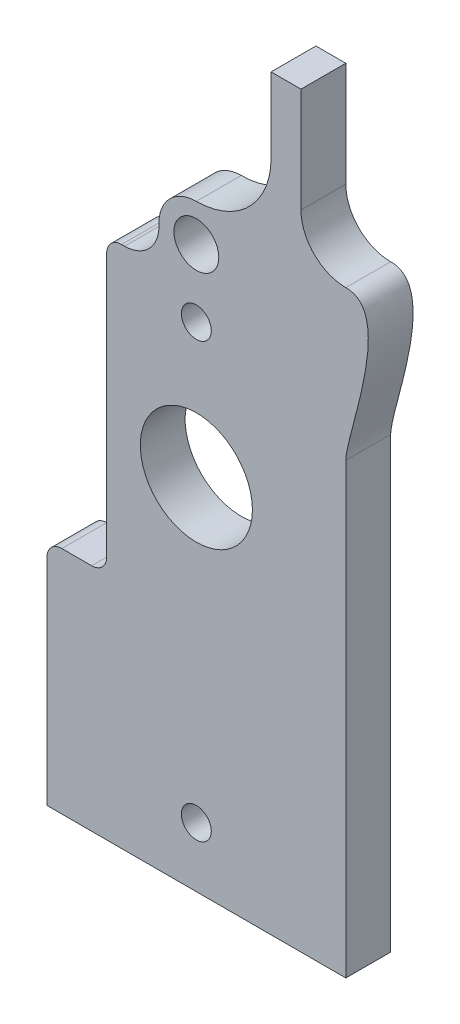
ISO-10303-21;
HEADER;
FILE_DESCRIPTION(('STEP AP214'),'2;1');
FILE_NAME('part.step','',(''),(''),'','','');
FILE_SCHEMA(('AUTOMOTIVE_DESIGN { 1 0 10303 214 1 1 1 1 }'));
ENDSEC;
DATA;
#1=APPLICATION_CONTEXT('core data for automotive mechanical design processes');
#2=APPLICATION_PROTOCOL_DEFINITION('international standard','automotive_design',2000,#1);
#3=PRODUCT_CONTEXT('',#1,'mechanical');
#4=PRODUCT('Part','Part','',(#3));
#5=PRODUCT_RELATED_PRODUCT_CATEGORY('part','',(#4));
#6=PRODUCT_DEFINITION_FORMATION('','',#4);
#7=PRODUCT_DEFINITION_CONTEXT('part definition',#1,'design');
#8=PRODUCT_DEFINITION('design','',#6,#7);
#9=PRODUCT_DEFINITION_SHAPE('','',#8);
#10=(LENGTH_UNIT() NAMED_UNIT(*) SI_UNIT(.MILLI.,.METRE.));
#11=(NAMED_UNIT(*) PLANE_ANGLE_UNIT() SI_UNIT($,.RADIAN.));
#12=(NAMED_UNIT(*) SI_UNIT($,.STERADIAN.) SOLID_ANGLE_UNIT());
#13=UNCERTAINTY_MEASURE_WITH_UNIT(LENGTH_MEASURE(1.E-05),#10,'distance_accuracy_value','');
#14=(GEOMETRIC_REPRESENTATION_CONTEXT(3) GLOBAL_UNCERTAINTY_ASSIGNED_CONTEXT((#13)) GLOBAL_UNIT_ASSIGNED_CONTEXT((#10,
#11,#12)) REPRESENTATION_CONTEXT('',''));
#15=CARTESIAN_POINT('',(0.,0.,0.));
#16=DIRECTION('',(0.,0.,1.));
#17=DIRECTION('',(1.,0.,0.));
#18=AXIS2_PLACEMENT_3D('',#15,#16,#17);
#19=CARTESIAN_POINT('',(11.2684211738149,35.6016585340508,3.));
#20=DIRECTION('',(0.,0.,1.));
#21=DIRECTION('',(1.,0.,0.));
#22=AXIS2_PLACEMENT_3D('',#19,#20,#21);
#23=PLANE('',#22);
#24=CARTESIAN_POINT('',(0.,4.,3.));
#25=DIRECTION('',(0.,0.,1.));
#26=DIRECTION('',(1.,0.,0.));
#27=AXIS2_PLACEMENT_3D('',#24,#25,#26);
#28=CIRCLE('',#27,1.);
#29=CARTESIAN_POINT('',(1.,4.,3.));
#30=VERTEX_POINT('',#29);
#31=EDGE_CURVE('E374',#30,#30,#28,.T.);
#32=ORIENTED_EDGE('',*,*,#31,.F.);
#33=EDGE_LOOP('',(#32));
#34=FACE_BOUND('',#33,.T.);
#35=CARTESIAN_POINT('',(0.,37.5,3.));
#36=DIRECTION('',(0.,0.,1.));
#37=DIRECTION('',(1.,0.,0.));
#38=AXIS2_PLACEMENT_3D('',#35,#36,#37);
#39=CIRCLE('',#38,1.5);
#40=CARTESIAN_POINT('',(1.5,37.5,3.));
#41=VERTEX_POINT('',#40);
#42=EDGE_CURVE('E193',#41,#41,#39,.T.);
#43=ORIENTED_EDGE('',*,*,#42,.F.);
#44=EDGE_LOOP('',(#43));
#45=FACE_BOUND('',#44,.T.);
#46=DIRECTION('',(1.,0.,0.));
#47=VECTOR('',#46,1.);
#48=CARTESIAN_POINT('',(-10.,0.,3.));
#49=LINE('',#48,#47);
#50=CARTESIAN_POINT('',(-10.,0.,3.));
#51=VERTEX_POINT('',#50);
#52=CARTESIAN_POINT('',(10.,0.,3.));
#53=VERTEX_POINT('',#52);
#54=EDGE_CURVE('E230',#51,#53,#49,.T.);
#55=ORIENTED_EDGE('',*,*,#54,.T.);
#56=DIRECTION('',(0.,1.,0.));
#57=VECTOR('',#56,1.);
#58=CARTESIAN_POINT('',(10.,0.,3.));
#59=LINE('',#58,#57);
#60=CARTESIAN_POINT('',(10.,30.,3.));
#61=VERTEX_POINT('',#60);
#62=EDGE_CURVE('E122',#53,#61,#59,.T.);
#63=ORIENTED_EDGE('',*,*,#62,.T.);
#64=CARTESIAN_POINT('',(9.99999999999999,30.,3.));
#65=CARTESIAN_POINT('',(10.,31.6044227574687,3.));
#66=CARTESIAN_POINT('',(13.3824564635064,40.,3.));
#67=CARTESIAN_POINT('',(9.99999999999999,40.,3.));
#68=B_SPLINE_CURVE_WITH_KNOTS('',3,(#64,#65,#66,#67),.UNSPECIFIED.,.F.,.F.,(4,4),(0.,1.),.UNSPECIFIED.);
#69=CARTESIAN_POINT('',(9.99999999999999,40.,3.));
#70=VERTEX_POINT('',#69);
#71=EDGE_CURVE('E275',#61,#70,#68,.T.);
#72=ORIENTED_EDGE('',*,*,#71,.T.);
#73=CARTESIAN_POINT('',(10.,43.,3.));
#74=DIRECTION('',(0.,0.,-1.));
#75=DIRECTION('',(1.,0.,0.));
#76=AXIS2_PLACEMENT_3D('',#73,#74,#75);
#77=CIRCLE('',#76,3.);
#78=CARTESIAN_POINT('',(7.,43.,3.));
#79=VERTEX_POINT('',#78);
#80=EDGE_CURVE('E294',#70,#79,#77,.T.);
#81=ORIENTED_EDGE('',*,*,#80,.T.);
#82=DIRECTION('',(0.,1.,0.));
#83=VECTOR('',#82,1.);
#84=CARTESIAN_POINT('',(7.,50.,3.));
#85=LINE('',#84,#83);
#86=CARTESIAN_POINT('',(7.,50.,3.));
#87=VERTEX_POINT('',#86);
#88=EDGE_CURVE('E291',#79,#87,#85,.T.);
#89=ORIENTED_EDGE('',*,*,#88,.T.);
#90=DIRECTION('',(-1.,0.,0.));
#91=VECTOR('',#90,1.);
#92=CARTESIAN_POINT('',(5.,50.,3.));
#93=LINE('',#92,#91);
#94=CARTESIAN_POINT('',(5.,50.,3.));
#95=VERTEX_POINT('',#94);
#96=EDGE_CURVE('E293',#87,#95,#93,.T.);
#97=ORIENTED_EDGE('',*,*,#96,.T.);
#98=DIRECTION('',(0.,-1.,0.));
#99=VECTOR('',#98,1.);
#100=CARTESIAN_POINT('',(5.,45.,3.));
#101=LINE('',#100,#99);
#102=CARTESIAN_POINT('',(5.,45.,3.));
#103=VERTEX_POINT('',#102);
#104=EDGE_CURVE('E296',#95,#103,#101,.T.);
#105=ORIENTED_EDGE('',*,*,#104,.T.);
#106=CARTESIAN_POINT('',(0.,45.,3.));
#107=DIRECTION('',(0.,0.,-1.));
#108=DIRECTION('',(1.,0.,0.));
#109=AXIS2_PLACEMENT_3D('',#106,#107,#108);
#110=CIRCLE('',#109,5.);
#111=CARTESIAN_POINT('',(0.,40.,3.));
#112=VERTEX_POINT('',#111);
#113=EDGE_CURVE('E302',#103,#112,#110,.T.);
#114=ORIENTED_EDGE('',*,*,#113,.T.);
#115=CARTESIAN_POINT('',(0.,37.5,3.));
#116=DIRECTION('',(0.,0.,1.));
#117=DIRECTION('',(1.,0.,0.));
#118=AXIS2_PLACEMENT_3D('',#115,#116,#117);
#119=CIRCLE('',#118,2.5);
#120=CARTESIAN_POINT('',(-2.49999999999999,37.5,3.));
#121=VERTEX_POINT('',#120);
#122=EDGE_CURVE('E304',#112,#121,#119,.T.);
#123=ORIENTED_EDGE('',*,*,#122,.T.);
#124=DIRECTION('',(0.,-1.,0.));
#125=VECTOR('',#124,1.);
#126=CARTESIAN_POINT('',(-2.49999999999999,37.3,3.));
#127=LINE('',#126,#125);
#128=CARTESIAN_POINT('',(-2.49999999999999,37.3,3.));
#129=VERTEX_POINT('',#128);
#130=EDGE_CURVE('E306',#121,#129,#127,.T.);
#131=ORIENTED_EDGE('',*,*,#130,.T.);
#132=CARTESIAN_POINT('',(-4.8,37.3,3.));
#133=DIRECTION('',(0.,0.,-1.));
#134=DIRECTION('',(1.,0.,0.));
#135=AXIS2_PLACEMENT_3D('',#132,#133,#134);
#136=CIRCLE('',#135,2.3);
#137=CARTESIAN_POINT('',(-4.80000000000001,35.,3.));
#138=VERTEX_POINT('',#137);
#139=EDGE_CURVE('E308',#129,#138,#136,.T.);
#140=ORIENTED_EDGE('',*,*,#139,.T.);
#141=DIRECTION('',(-1.,0.,0.));
#142=VECTOR('',#141,1.);
#143=CARTESIAN_POINT('',(-4.99999999999999,35.,3.));
#144=LINE('',#143,#142);
#145=CARTESIAN_POINT('',(-4.99999999999999,35.,3.));
#146=VERTEX_POINT('',#145);
#147=EDGE_CURVE('E310',#138,#146,#144,.T.);
#148=ORIENTED_EDGE('',*,*,#147,.T.);
#149=CARTESIAN_POINT('',(-5.,34.,3.));
#150=DIRECTION('',(0.,0.,1.));
#151=DIRECTION('',(-1.,0.,0.));
#152=AXIS2_PLACEMENT_3D('',#149,#150,#151);
#153=CIRCLE('',#152,1.);
#154=CARTESIAN_POINT('',(-6.,34.,3.));
#155=VERTEX_POINT('',#154);
#156=EDGE_CURVE('E312',#146,#155,#153,.T.);
#157=ORIENTED_EDGE('',*,*,#156,.T.);
#158=DIRECTION('',(0.,-1.,0.));
#159=VECTOR('',#158,1.);
#160=CARTESIAN_POINT('',(-6.,34.,3.));
#161=LINE('',#160,#159);
#162=CARTESIAN_POINT('',(-6.,16.383156030193,3.));
#163=VERTEX_POINT('',#162);
#164=EDGE_CURVE('E314',#155,#163,#161,.T.);
#165=ORIENTED_EDGE('',*,*,#164,.T.);
#166=CARTESIAN_POINT('',(-7.,16.3831560301929,3.));
#167=DIRECTION('',(0.,0.,-1.));
#168=DIRECTION('',(1.,0.,0.));
#169=AXIS2_PLACEMENT_3D('',#166,#167,#168);
#170=CIRCLE('',#169,1.);
#171=CARTESIAN_POINT('',(-7.00000000000001,15.3831560301929,3.));
#172=VERTEX_POINT('',#171);
#173=EDGE_CURVE('E171',#163,#172,#170,.T.);
#174=ORIENTED_EDGE('',*,*,#173,.T.);
#175=DIRECTION('',(-1.,0.,0.));
#176=VECTOR('',#175,1.);
#177=CARTESIAN_POINT('',(-7.00000000000001,15.3831560301929,3.));
#178=LINE('',#177,#176);
#179=CARTESIAN_POINT('',(-9.,15.3831560301929,3.));
#180=VERTEX_POINT('',#179);
#181=EDGE_CURVE('E165',#172,#180,#178,.T.);
#182=ORIENTED_EDGE('',*,*,#181,.T.);
#183=CARTESIAN_POINT('',(-9.00000000000001,14.3831560301929,3.));
#184=DIRECTION('',(0.,0.,1.));
#185=DIRECTION('',(1.,0.,0.));
#186=AXIS2_PLACEMENT_3D('',#183,#184,#185);
#187=CIRCLE('',#186,1.);
#188=CARTESIAN_POINT('',(-10.,14.3831560301929,3.));
#189=VERTEX_POINT('',#188);
#190=EDGE_CURVE('E169',#180,#189,#187,.T.);
#191=ORIENTED_EDGE('',*,*,#190,.T.);
#192=DIRECTION('',(0.,-1.,0.));
#193=VECTOR('',#192,1.);
#194=CARTESIAN_POINT('',(-10.,14.3831560301929,3.));
#195=LINE('',#194,#193);
#196=EDGE_CURVE('E49',#189,#51,#195,.T.);
#197=ORIENTED_EDGE('',*,*,#196,.T.);
#198=EDGE_LOOP('',(#55,#63,#72,#81,#89,#97,#105,#114,#123,#131,#140,#148,#157,#165,#174,#182,
#191,#197));
#199=FACE_BOUND('',#198,.T.);
#200=CARTESIAN_POINT('',(0.,33.,3.));
#201=DIRECTION('',(0.,0.,1.));
#202=DIRECTION('',(1.,0.,0.));
#203=AXIS2_PLACEMENT_3D('',#200,#201,#202);
#204=CIRCLE('',#203,1.);
#205=CARTESIAN_POINT('',(1.,33.,3.));
#206=VERTEX_POINT('',#205);
#207=EDGE_CURVE('E380',#206,#206,#204,.T.);
#208=ORIENTED_EDGE('',*,*,#207,.F.);
#209=EDGE_LOOP('',(#208));
#210=FACE_BOUND('',#209,.T.);
#211=CARTESIAN_POINT('',(0.,24.,3.));
#212=DIRECTION('',(0.,0.,1.));
#213=DIRECTION('',(1.,0.,0.));
#214=AXIS2_PLACEMENT_3D('',#211,#212,#213);
#215=CIRCLE('',#214,3.75);
#216=CARTESIAN_POINT('',(3.75,24.,3.));
#217=VERTEX_POINT('',#216);
#218=EDGE_CURVE('E365',#217,#217,#215,.T.);
#219=ORIENTED_EDGE('',*,*,#218,.F.);
#220=EDGE_LOOP('',(#219));
#221=FACE_BOUND('',#220,.T.);
#222=ADVANCED_FACE('F32',(#34,#45,#199,#210,#221),#23,.T.);
#223=CARTESIAN_POINT('',(11.2684211738149,35.6016585340508,0.));
#224=DIRECTION('',(0.,0.,1.));
#225=DIRECTION('',(1.,0.,0.));
#226=AXIS2_PLACEMENT_3D('',#223,#224,#225);
#227=PLANE('',#226);
#228=CARTESIAN_POINT('',(0.,4.,0.));
#229=DIRECTION('',(0.,0.,1.));
#230=DIRECTION('',(1.,0.,0.));
#231=AXIS2_PLACEMENT_3D('',#228,#229,#230);
#232=CIRCLE('',#231,1.);
#233=CARTESIAN_POINT('',(1.,4.,0.));
#234=VERTEX_POINT('',#233);
#235=EDGE_CURVE('E371',#234,#234,#232,.T.);
#236=ORIENTED_EDGE('',*,*,#235,.T.);
#237=EDGE_LOOP('',(#236));
#238=FACE_BOUND('',#237,.T.);
#239=CARTESIAN_POINT('',(0.,37.5,0.));
#240=DIRECTION('',(0.,0.,1.));
#241=DIRECTION('',(1.,0.,0.));
#242=AXIS2_PLACEMENT_3D('',#239,#240,#241);
#243=CIRCLE('',#242,1.5);
#244=CARTESIAN_POINT('',(1.5,37.5,0.));
#245=VERTEX_POINT('',#244);
#246=EDGE_CURVE('E383',#245,#245,#243,.T.);
#247=ORIENTED_EDGE('',*,*,#246,.T.);
#248=EDGE_LOOP('',(#247));
#249=FACE_BOUND('',#248,.T.);
#250=DIRECTION('',(1.,0.,0.));
#251=VECTOR('',#250,1.);
#252=CARTESIAN_POINT('',(-10.,0.,0.));
#253=LINE('',#252,#251);
#254=CARTESIAN_POINT('',(-10.,0.,0.));
#255=VERTEX_POINT('',#254);
#256=CARTESIAN_POINT('',(10.,0.,0.));
#257=VERTEX_POINT('',#256);
#258=EDGE_CURVE('E189',#255,#257,#253,.T.);
#259=ORIENTED_EDGE('',*,*,#258,.F.);
#260=DIRECTION('',(0.,-1.,0.));
#261=VECTOR('',#260,1.);
#262=CARTESIAN_POINT('',(-10.,14.3831560301929,0.));
#263=LINE('',#262,#261);
#264=CARTESIAN_POINT('',(-10.,14.3831560301929,0.));
#265=VERTEX_POINT('',#264);
#266=EDGE_CURVE('E114',#265,#255,#263,.T.);
#267=ORIENTED_EDGE('',*,*,#266,.F.);
#268=CARTESIAN_POINT('',(-9.00000000000001,14.3831560301929,0.));
#269=DIRECTION('',(0.,0.,1.));
#270=DIRECTION('',(1.,0.,0.));
#271=AXIS2_PLACEMENT_3D('',#268,#269,#270);
#272=CIRCLE('',#271,1.);
#273=CARTESIAN_POINT('',(-9.,15.3831560301929,0.));
#274=VERTEX_POINT('',#273);
#275=EDGE_CURVE('E108',#274,#265,#272,.T.);
#276=ORIENTED_EDGE('',*,*,#275,.F.);
#277=DIRECTION('',(-1.,0.,0.));
#278=VECTOR('',#277,1.);
#279=CARTESIAN_POINT('',(-7.00000000000001,15.3831560301929,0.));
#280=LINE('',#279,#278);
#281=CARTESIAN_POINT('',(-7.00000000000001,15.3831560301929,0.));
#282=VERTEX_POINT('',#281);
#283=EDGE_CURVE('E179',#282,#274,#280,.T.);
#284=ORIENTED_EDGE('',*,*,#283,.F.);
#285=CARTESIAN_POINT('',(-7.,16.3831560301929,0.));
#286=DIRECTION('',(0.,0.,-1.));
#287=DIRECTION('',(1.,0.,0.));
#288=AXIS2_PLACEMENT_3D('',#285,#286,#287);
#289=CIRCLE('',#288,1.);
#290=CARTESIAN_POINT('',(-6.,16.383156030193,0.));
#291=VERTEX_POINT('',#290);
#292=EDGE_CURVE('E225',#291,#282,#289,.T.);
#293=ORIENTED_EDGE('',*,*,#292,.F.);
#294=DIRECTION('',(0.,-1.,0.));
#295=VECTOR('',#294,1.);
#296=CARTESIAN_POINT('',(-6.,16.383156030193,0.));
#297=LINE('',#296,#295);
#298=CARTESIAN_POINT('',(-6.,34.,0.));
#299=VERTEX_POINT('',#298);
#300=EDGE_CURVE('E223',#299,#291,#297,.T.);
#301=ORIENTED_EDGE('',*,*,#300,.F.);
#302=CARTESIAN_POINT('',(-5.,34.,0.));
#303=DIRECTION('',(0.,0.,1.));
#304=DIRECTION('',(-1.,0.,0.));
#305=AXIS2_PLACEMENT_3D('',#302,#303,#304);
#306=CIRCLE('',#305,1.);
#307=CARTESIAN_POINT('',(-4.99999999999999,35.,0.));
#308=VERTEX_POINT('',#307);
#309=EDGE_CURVE('E220',#308,#299,#306,.T.);
#310=ORIENTED_EDGE('',*,*,#309,.F.);
#311=DIRECTION('',(-1.,0.,0.));
#312=VECTOR('',#311,1.);
#313=CARTESIAN_POINT('',(-4.99999999999999,35.,0.));
#314=LINE('',#313,#312);
#315=CARTESIAN_POINT('',(-4.80000000000001,35.,0.));
#316=VERTEX_POINT('',#315);
#317=EDGE_CURVE('E218',#316,#308,#314,.T.);
#318=ORIENTED_EDGE('',*,*,#317,.F.);
#319=CARTESIAN_POINT('',(-4.8,37.3,0.));
#320=DIRECTION('',(0.,0.,-1.));
#321=DIRECTION('',(1.,0.,0.));
#322=AXIS2_PLACEMENT_3D('',#319,#320,#321);
#323=CIRCLE('',#322,2.3);
#324=CARTESIAN_POINT('',(-2.49999999999999,37.3,0.));
#325=VERTEX_POINT('',#324);
#326=EDGE_CURVE('E216',#325,#316,#323,.T.);
#327=ORIENTED_EDGE('',*,*,#326,.F.);
#328=DIRECTION('',(0.,-1.,0.));
#329=VECTOR('',#328,1.);
#330=CARTESIAN_POINT('',(-2.49999999999999,37.3,0.));
#331=LINE('',#330,#329);
#332=CARTESIAN_POINT('',(-2.49999999999999,37.5,0.));
#333=VERTEX_POINT('',#332);
#334=EDGE_CURVE('E214',#333,#325,#331,.T.);
#335=ORIENTED_EDGE('',*,*,#334,.F.);
#336=CARTESIAN_POINT('',(0.,37.5,0.));
#337=DIRECTION('',(0.,0.,1.));
#338=DIRECTION('',(1.,0.,0.));
#339=AXIS2_PLACEMENT_3D('',#336,#337,#338);
#340=CIRCLE('',#339,2.5);
#341=CARTESIAN_POINT('',(0.,40.,0.));
#342=VERTEX_POINT('',#341);
#343=EDGE_CURVE('E212',#342,#333,#340,.T.);
#344=ORIENTED_EDGE('',*,*,#343,.F.);
#345=CARTESIAN_POINT('',(0.,45.,0.));
#346=DIRECTION('',(0.,0.,-1.));
#347=DIRECTION('',(1.,0.,0.));
#348=AXIS2_PLACEMENT_3D('',#345,#346,#347);
#349=CIRCLE('',#348,5.);
#350=CARTESIAN_POINT('',(5.,45.,0.));
#351=VERTEX_POINT('',#350);
#352=EDGE_CURVE('E210',#351,#342,#349,.T.);
#353=ORIENTED_EDGE('',*,*,#352,.F.);
#354=DIRECTION('',(0.,-1.,0.));
#355=VECTOR('',#354,1.);
#356=CARTESIAN_POINT('',(5.,45.,0.));
#357=LINE('',#356,#355);
#358=CARTESIAN_POINT('',(5.,50.,0.));
#359=VERTEX_POINT('',#358);
#360=EDGE_CURVE('E208',#359,#351,#357,.T.);
#361=ORIENTED_EDGE('',*,*,#360,.F.);
#362=DIRECTION('',(-1.,0.,0.));
#363=VECTOR('',#362,1.);
#364=CARTESIAN_POINT('',(5.,50.,0.));
#365=LINE('',#364,#363);
#366=CARTESIAN_POINT('',(7.,50.,0.));
#367=VERTEX_POINT('',#366);
#368=EDGE_CURVE('E206',#367,#359,#365,.T.);
#369=ORIENTED_EDGE('',*,*,#368,.F.);
#370=DIRECTION('',(0.,1.,0.));
#371=VECTOR('',#370,1.);
#372=CARTESIAN_POINT('',(7.,50.,0.));
#373=LINE('',#372,#371);
#374=CARTESIAN_POINT('',(7.,43.,0.));
#375=VERTEX_POINT('',#374);
#376=EDGE_CURVE('E204',#375,#367,#373,.T.);
#377=ORIENTED_EDGE('',*,*,#376,.F.);
#378=CARTESIAN_POINT('',(10.,43.,0.));
#379=DIRECTION('',(0.,0.,-1.));
#380=DIRECTION('',(1.,0.,0.));
#381=AXIS2_PLACEMENT_3D('',#378,#379,#380);
#382=CIRCLE('',#381,3.);
#383=CARTESIAN_POINT('',(9.99999999999999,40.,0.));
#384=VERTEX_POINT('',#383);
#385=EDGE_CURVE('E199',#384,#375,#382,.T.);
#386=ORIENTED_EDGE('',*,*,#385,.F.);
#387=CARTESIAN_POINT('',(9.99999999999999,30.,0.));
#388=CARTESIAN_POINT('',(10.,31.6044227574687,0.));
#389=CARTESIAN_POINT('',(13.3824564635064,40.,0.));
#390=CARTESIAN_POINT('',(9.99999999999999,40.,0.));
#391=B_SPLINE_CURVE_WITH_KNOTS('',3,(#387,#388,#389,#390),.UNSPECIFIED.,.F.,.F.,(4,4),(0.,1.),.UNSPECIFIED.);
#392=CARTESIAN_POINT('',(10.,30.,0.));
#393=VERTEX_POINT('',#392);
#394=EDGE_CURVE('E195',#393,#384,#391,.T.);
#395=ORIENTED_EDGE('',*,*,#394,.F.);
#396=DIRECTION('',(0.,1.,0.));
#397=VECTOR('',#396,1.);
#398=CARTESIAN_POINT('',(10.,0.,0.));
#399=LINE('',#398,#397);
#400=EDGE_CURVE('E192',#257,#393,#399,.T.);
#401=ORIENTED_EDGE('',*,*,#400,.F.);
#402=EDGE_LOOP('',(#259,#267,#276,#284,#293,#301,#310,#318,#327,#335,#344,#353,#361,#369,#377,
#386,#395,#401));
#403=FACE_BOUND('',#402,.T.);
#404=CARTESIAN_POINT('',(0.,33.,0.));
#405=DIRECTION('',(0.,0.,1.));
#406=DIRECTION('',(1.,0.,0.));
#407=AXIS2_PLACEMENT_3D('',#404,#405,#406);
#408=CIRCLE('',#407,1.);
#409=CARTESIAN_POINT('',(1.,33.,0.));
#410=VERTEX_POINT('',#409);
#411=EDGE_CURVE('E377',#410,#410,#408,.T.);
#412=ORIENTED_EDGE('',*,*,#411,.T.);
#413=EDGE_LOOP('',(#412));
#414=FACE_BOUND('',#413,.T.);
#415=CARTESIAN_POINT('',(0.,24.,0.));
#416=DIRECTION('',(0.,0.,1.));
#417=DIRECTION('',(1.,0.,0.));
#418=AXIS2_PLACEMENT_3D('',#415,#416,#417);
#419=CIRCLE('',#418,3.75);
#420=CARTESIAN_POINT('',(3.75,24.,0.));
#421=VERTEX_POINT('',#420);
#422=EDGE_CURVE('E368',#421,#421,#419,.T.);
#423=ORIENTED_EDGE('',*,*,#422,.T.);
#424=EDGE_LOOP('',(#423));
#425=FACE_BOUND('',#424,.T.);
#426=ADVANCED_FACE('F279',(#238,#249,#403,#414,#425),#227,.F.);
#427=CARTESIAN_POINT('',(-10.,0.,3.));
#428=DIRECTION('',(0.,1.,0.));
#429=DIRECTION('',(0.,0.,1.));
#430=AXIS2_PLACEMENT_3D('',#427,#428,#429);
#431=PLANE('',#430);
#432=ORIENTED_EDGE('',*,*,#258,.T.);
#433=DIRECTION('',(0.,0.,-1.));
#434=VECTOR('',#433,1.);
#435=CARTESIAN_POINT('',(10.,0.,3.));
#436=LINE('',#435,#434);
#437=EDGE_CURVE('E11',#53,#257,#436,.T.);
#438=ORIENTED_EDGE('',*,*,#437,.F.);
#439=ORIENTED_EDGE('',*,*,#54,.F.);
#440=DIRECTION('',(0.,0.,-1.));
#441=VECTOR('',#440,1.);
#442=CARTESIAN_POINT('',(-10.,0.,3.));
#443=LINE('',#442,#441);
#444=EDGE_CURVE('E185',#51,#255,#443,.T.);
#445=ORIENTED_EDGE('',*,*,#444,.T.);
#446=EDGE_LOOP('',(#432,#438,#439,#445));
#447=FACE_BOUND('',#446,.T.);
#448=ADVANCED_FACE('F34',(#447),#431,.F.);
#449=CARTESIAN_POINT('',(10.,0.,3.));
#450=DIRECTION('',(-1.,0.,0.));
#451=DIRECTION('',(0.,-1.,0.));
#452=AXIS2_PLACEMENT_3D('',#449,#450,#451);
#453=PLANE('',#452);
#454=ORIENTED_EDGE('',*,*,#400,.T.);
#455=DIRECTION('',(0.,0.,-1.));
#456=VECTOR('',#455,1.);
#457=CARTESIAN_POINT('',(10.,30.,3.));
#458=LINE('',#457,#456);
#459=EDGE_CURVE('E41',#61,#393,#458,.T.);
#460=ORIENTED_EDGE('',*,*,#459,.F.);
#461=ORIENTED_EDGE('',*,*,#62,.F.);
#462=ORIENTED_EDGE('',*,*,#437,.T.);
#463=EDGE_LOOP('',(#454,#460,#461,#462));
#464=FACE_BOUND('',#463,.T.);
#465=ADVANCED_FACE('F400',(#464),#453,.F.);
#466=DIRECTION('',(0.,0.,-1.));
#467=VECTOR('',#466,1.);
#468=SURFACE_OF_LINEAR_EXTRUSION('',#68,#467);
#469=ORIENTED_EDGE('',*,*,#394,.T.);
#470=DIRECTION('',(0.,0.,-1.));
#471=VECTOR('',#470,1.);
#472=CARTESIAN_POINT('',(9.99999999999999,40.,3.));
#473=LINE('',#472,#471);
#474=EDGE_CURVE('E267',#70,#384,#473,.T.);
#475=ORIENTED_EDGE('',*,*,#474,.F.);
#476=ORIENTED_EDGE('',*,*,#71,.F.);
#477=ORIENTED_EDGE('',*,*,#459,.T.);
#478=EDGE_LOOP('',(#469,#475,#476,#477));
#479=FACE_BOUND('',#478,.T.);
#480=ADVANCED_FACE('F273',(#479),#468,.F.);
#481=CARTESIAN_POINT('',(10.,43.,3.));
#482=DIRECTION('',(0.,0.,-1.));
#483=DIRECTION('',(-1.,0.,0.));
#484=AXIS2_PLACEMENT_3D('',#481,#482,#483);
#485=CYLINDRICAL_SURFACE('',#484,3.);
#486=ORIENTED_EDGE('',*,*,#385,.T.);
#487=DIRECTION('',(0.,0.,-1.));
#488=VECTOR('',#487,1.);
#489=CARTESIAN_POINT('',(7.,43.,3.));
#490=LINE('',#489,#488);
#491=EDGE_CURVE('E264',#79,#375,#490,.T.);
#492=ORIENTED_EDGE('',*,*,#491,.F.);
#493=ORIENTED_EDGE('',*,*,#80,.F.);
#494=ORIENTED_EDGE('',*,*,#474,.T.);
#495=EDGE_LOOP('',(#486,#492,#493,#494));
#496=FACE_BOUND('',#495,.T.);
#497=ADVANCED_FACE('F285',(#496),#485,.F.);
#498=CARTESIAN_POINT('',(7.,50.,3.));
#499=DIRECTION('',(-1.,0.,0.));
#500=DIRECTION('',(0.,0.,1.));
#501=AXIS2_PLACEMENT_3D('',#498,#499,#500);
#502=PLANE('',#501);
#503=ORIENTED_EDGE('',*,*,#376,.T.);
#504=DIRECTION('',(0.,0.,-1.));
#505=VECTOR('',#504,1.);
#506=CARTESIAN_POINT('',(7.,50.,3.));
#507=LINE('',#506,#505);
#508=EDGE_CURVE('E261',#87,#367,#507,.T.);
#509=ORIENTED_EDGE('',*,*,#508,.F.);
#510=ORIENTED_EDGE('',*,*,#88,.F.);
#511=ORIENTED_EDGE('',*,*,#491,.T.);
#512=EDGE_LOOP('',(#503,#509,#510,#511));
#513=FACE_BOUND('',#512,.T.);
#514=ADVANCED_FACE('F289',(#513),#502,.F.);
#515=CARTESIAN_POINT('',(5.,50.,3.));
#516=DIRECTION('',(0.,-1.,0.));
#517=DIRECTION('',(0.,0.,-1.));
#518=AXIS2_PLACEMENT_3D('',#515,#516,#517);
#519=PLANE('',#518);
#520=ORIENTED_EDGE('',*,*,#368,.T.);
#521=DIRECTION('',(0.,0.,-1.));
#522=VECTOR('',#521,1.);
#523=CARTESIAN_POINT('',(5.,50.,3.));
#524=LINE('',#523,#522);
#525=EDGE_CURVE('E258',#95,#359,#524,.T.);
#526=ORIENTED_EDGE('',*,*,#525,.F.);
#527=ORIENTED_EDGE('',*,*,#96,.F.);
#528=ORIENTED_EDGE('',*,*,#508,.T.);
#529=EDGE_LOOP('',(#520,#526,#527,#528));
#530=FACE_BOUND('',#529,.T.);
#531=ADVANCED_FACE('F443',(#530),#519,.F.);
#532=CARTESIAN_POINT('',(5.,45.,3.));
#533=DIRECTION('',(1.,0.,0.));
#534=DIRECTION('',(0.,0.,-1.));
#535=AXIS2_PLACEMENT_3D('',#532,#533,#534);
#536=PLANE('',#535);
#537=ORIENTED_EDGE('',*,*,#360,.T.);
#538=DIRECTION('',(0.,0.,-1.));
#539=VECTOR('',#538,1.);
#540=CARTESIAN_POINT('',(5.,45.,3.));
#541=LINE('',#540,#539);
#542=EDGE_CURVE('E255',#103,#351,#541,.T.);
#543=ORIENTED_EDGE('',*,*,#542,.F.);
#544=ORIENTED_EDGE('',*,*,#104,.F.);
#545=ORIENTED_EDGE('',*,*,#525,.T.);
#546=EDGE_LOOP('',(#537,#543,#544,#545));
#547=FACE_BOUND('',#546,.T.);
#548=ADVANCED_FACE('F450',(#547),#536,.F.);
#549=CARTESIAN_POINT('',(0.,45.,3.));
#550=DIRECTION('',(0.,0.,-1.));
#551=DIRECTION('',(-1.,0.,0.));
#552=AXIS2_PLACEMENT_3D('',#549,#550,#551);
#553=CYLINDRICAL_SURFACE('',#552,5.);
#554=ORIENTED_EDGE('',*,*,#352,.T.);
#555=DIRECTION('',(0.,0.,-1.));
#556=VECTOR('',#555,1.);
#557=CARTESIAN_POINT('',(0.,40.,3.));
#558=LINE('',#557,#556);
#559=EDGE_CURVE('E252',#112,#342,#558,.T.);
#560=ORIENTED_EDGE('',*,*,#559,.F.);
#561=ORIENTED_EDGE('',*,*,#113,.F.);
#562=ORIENTED_EDGE('',*,*,#542,.T.);
#563=EDGE_LOOP('',(#554,#560,#561,#562));
#564=FACE_BOUND('',#563,.T.);
#565=ADVANCED_FACE('F459',(#564),#553,.F.);
#566=CARTESIAN_POINT('',(0.,37.5,3.));
#567=DIRECTION('',(0.,0.,-1.));
#568=DIRECTION('',(-1.,0.,0.));
#569=AXIS2_PLACEMENT_3D('',#566,#567,#568);
#570=CYLINDRICAL_SURFACE('',#569,2.5);
#571=ORIENTED_EDGE('',*,*,#343,.T.);
#572=DIRECTION('',(0.,0.,-1.));
#573=VECTOR('',#572,1.);
#574=CARTESIAN_POINT('',(-2.49999999999999,37.5,3.));
#575=LINE('',#574,#573);
#576=EDGE_CURVE('E249',#121,#333,#575,.T.);
#577=ORIENTED_EDGE('',*,*,#576,.F.);
#578=ORIENTED_EDGE('',*,*,#122,.F.);
#579=ORIENTED_EDGE('',*,*,#559,.T.);
#580=EDGE_LOOP('',(#571,#577,#578,#579));
#581=FACE_BOUND('',#580,.T.);
#582=ADVANCED_FACE('F468',(#581),#570,.T.);
#583=CARTESIAN_POINT('',(-2.49999999999999,37.3,3.));
#584=DIRECTION('',(1.,0.,0.));
#585=DIRECTION('',(0.,0.,-1.));
#586=AXIS2_PLACEMENT_3D('',#583,#584,#585);
#587=PLANE('',#586);
#588=ORIENTED_EDGE('',*,*,#334,.T.);
#589=DIRECTION('',(0.,0.,-1.));
#590=VECTOR('',#589,1.);
#591=CARTESIAN_POINT('',(-2.49999999999999,37.3,3.));
#592=LINE('',#591,#590);
#593=EDGE_CURVE('E246',#129,#325,#592,.T.);
#594=ORIENTED_EDGE('',*,*,#593,.F.);
#595=ORIENTED_EDGE('',*,*,#130,.F.);
#596=ORIENTED_EDGE('',*,*,#576,.T.);
#597=EDGE_LOOP('',(#588,#594,#595,#596));
#598=FACE_BOUND('',#597,.T.);
#599=ADVANCED_FACE('F477',(#598),#587,.F.);
#600=CARTESIAN_POINT('',(-4.8,37.3,3.));
#601=DIRECTION('',(0.,0.,-1.));
#602=DIRECTION('',(-1.,0.,0.));
#603=AXIS2_PLACEMENT_3D('',#600,#601,#602);
#604=CYLINDRICAL_SURFACE('',#603,2.3);
#605=ORIENTED_EDGE('',*,*,#326,.T.);
#606=DIRECTION('',(0.,0.,-1.));
#607=VECTOR('',#606,1.);
#608=CARTESIAN_POINT('',(-4.80000000000001,35.,3.));
#609=LINE('',#608,#607);
#610=EDGE_CURVE('E243',#138,#316,#609,.T.);
#611=ORIENTED_EDGE('',*,*,#610,.F.);
#612=ORIENTED_EDGE('',*,*,#139,.F.);
#613=ORIENTED_EDGE('',*,*,#593,.T.);
#614=EDGE_LOOP('',(#605,#611,#612,#613));
#615=FACE_BOUND('',#614,.T.);
#616=ADVANCED_FACE('F486',(#615),#604,.F.);
#617=CARTESIAN_POINT('',(-4.99999999999999,35.,3.));
#618=DIRECTION('',(0.,-1.,0.));
#619=DIRECTION('',(0.,0.,-1.));
#620=AXIS2_PLACEMENT_3D('',#617,#618,#619);
#621=PLANE('',#620);
#622=ORIENTED_EDGE('',*,*,#317,.T.);
#623=DIRECTION('',(0.,0.,-1.));
#624=VECTOR('',#623,1.);
#625=CARTESIAN_POINT('',(-4.99999999999999,35.,3.));
#626=LINE('',#625,#624);
#627=EDGE_CURVE('E240',#146,#308,#626,.T.);
#628=ORIENTED_EDGE('',*,*,#627,.F.);
#629=ORIENTED_EDGE('',*,*,#147,.F.);
#630=ORIENTED_EDGE('',*,*,#610,.T.);
#631=EDGE_LOOP('',(#622,#628,#629,#630));
#632=FACE_BOUND('',#631,.T.);
#633=ADVANCED_FACE('F495',(#632),#621,.F.);
#634=CARTESIAN_POINT('',(-5.,34.,3.));
#635=DIRECTION('',(0.,0.,-1.));
#636=DIRECTION('',(-1.,0.,0.));
#637=AXIS2_PLACEMENT_3D('',#634,#635,#636);
#638=CYLINDRICAL_SURFACE('',#637,1.);
#639=ORIENTED_EDGE('',*,*,#309,.T.);
#640=DIRECTION('',(0.,0.,-1.));
#641=VECTOR('',#640,1.);
#642=CARTESIAN_POINT('',(-6.,34.,3.));
#643=LINE('',#642,#641);
#644=EDGE_CURVE('E237',#155,#299,#643,.T.);
#645=ORIENTED_EDGE('',*,*,#644,.F.);
#646=ORIENTED_EDGE('',*,*,#156,.F.);
#647=ORIENTED_EDGE('',*,*,#627,.T.);
#648=EDGE_LOOP('',(#639,#645,#646,#647));
#649=FACE_BOUND('',#648,.T.);
#650=ADVANCED_FACE('F504',(#649),#638,.T.);
#651=CARTESIAN_POINT('',(-6.,16.383156030193,3.));
#652=DIRECTION('',(1.,0.,0.));
#653=DIRECTION('',(0.,0.,-1.));
#654=AXIS2_PLACEMENT_3D('',#651,#652,#653);
#655=PLANE('',#654);
#656=ORIENTED_EDGE('',*,*,#300,.T.);
#657=DIRECTION('',(0.,0.,-1.));
#658=VECTOR('',#657,1.);
#659=CARTESIAN_POINT('',(-6.,16.383156030193,3.));
#660=LINE('',#659,#658);
#661=EDGE_CURVE('E234',#163,#291,#660,.T.);
#662=ORIENTED_EDGE('',*,*,#661,.F.);
#663=ORIENTED_EDGE('',*,*,#164,.F.);
#664=ORIENTED_EDGE('',*,*,#644,.T.);
#665=EDGE_LOOP('',(#656,#662,#663,#664));
#666=FACE_BOUND('',#665,.T.);
#667=ADVANCED_FACE('F320',(#666),#655,.F.);
#668=CARTESIAN_POINT('',(-7.,16.3831560301929,3.));
#669=DIRECTION('',(0.,0.,-1.));
#670=DIRECTION('',(-1.,0.,0.));
#671=AXIS2_PLACEMENT_3D('',#668,#669,#670);
#672=CYLINDRICAL_SURFACE('',#671,1.);
#673=ORIENTED_EDGE('',*,*,#292,.T.);
#674=DIRECTION('',(0.,0.,-1.));
#675=VECTOR('',#674,1.);
#676=CARTESIAN_POINT('',(-7.00000000000001,15.3831560301929,3.));
#677=LINE('',#676,#675);
#678=EDGE_CURVE('E180',#172,#282,#677,.T.);
#679=ORIENTED_EDGE('',*,*,#678,.F.);
#680=ORIENTED_EDGE('',*,*,#173,.F.);
#681=ORIENTED_EDGE('',*,*,#661,.T.);
#682=EDGE_LOOP('',(#673,#679,#680,#681));
#683=FACE_BOUND('',#682,.T.);
#684=ADVANCED_FACE('F323',(#683),#672,.F.);
#685=CARTESIAN_POINT('',(-7.00000000000001,15.3831560301929,3.));
#686=DIRECTION('',(0.,-1.,0.));
#687=DIRECTION('',(0.,0.,-1.));
#688=AXIS2_PLACEMENT_3D('',#685,#686,#687);
#689=PLANE('',#688);
#690=ORIENTED_EDGE('',*,*,#283,.T.);
#691=DIRECTION('',(0.,0.,-1.));
#692=VECTOR('',#691,1.);
#693=CARTESIAN_POINT('',(-9.,15.3831560301929,3.));
#694=LINE('',#693,#692);
#695=EDGE_CURVE('E176',#180,#274,#694,.T.);
#696=ORIENTED_EDGE('',*,*,#695,.F.);
#697=ORIENTED_EDGE('',*,*,#181,.F.);
#698=ORIENTED_EDGE('',*,*,#678,.T.);
#699=EDGE_LOOP('',(#690,#696,#697,#698));
#700=FACE_BOUND('',#699,.T.);
#701=ADVANCED_FACE('F177',(#700),#689,.F.);
#702=CARTESIAN_POINT('',(-9.00000000000001,14.3831560301929,3.));
#703=DIRECTION('',(0.,0.,-1.));
#704=DIRECTION('',(-1.,0.,0.));
#705=AXIS2_PLACEMENT_3D('',#702,#703,#704);
#706=CYLINDRICAL_SURFACE('',#705,1.);
#707=ORIENTED_EDGE('',*,*,#275,.T.);
#708=DIRECTION('',(0.,0.,-1.));
#709=VECTOR('',#708,1.);
#710=CARTESIAN_POINT('',(-10.,14.3831560301929,3.));
#711=LINE('',#710,#709);
#712=EDGE_CURVE('E181',#189,#265,#711,.T.);
#713=ORIENTED_EDGE('',*,*,#712,.F.);
#714=ORIENTED_EDGE('',*,*,#190,.F.);
#715=ORIENTED_EDGE('',*,*,#695,.T.);
#716=EDGE_LOOP('',(#707,#713,#714,#715));
#717=FACE_BOUND('',#716,.T.);
#718=ADVANCED_FACE('F183',(#717),#706,.T.);
#719=CARTESIAN_POINT('',(-10.,14.3831560301929,3.));
#720=DIRECTION('',(1.,0.,0.));
#721=DIRECTION('',(0.,1.,0.));
#722=AXIS2_PLACEMENT_3D('',#719,#720,#721);
#723=PLANE('',#722);
#724=ORIENTED_EDGE('',*,*,#266,.T.);
#725=ORIENTED_EDGE('',*,*,#444,.F.);
#726=ORIENTED_EDGE('',*,*,#196,.F.);
#727=ORIENTED_EDGE('',*,*,#712,.T.);
#728=EDGE_LOOP('',(#724,#725,#726,#727));
#729=FACE_BOUND('',#728,.T.);
#730=ADVANCED_FACE('F327',(#729),#723,.F.);
#731=CARTESIAN_POINT('',(0.,37.5,3.));
#732=DIRECTION('',(0.,0.,-1.));
#733=DIRECTION('',(-1.,0.,0.));
#734=AXIS2_PLACEMENT_3D('',#731,#732,#733);
#735=CYLINDRICAL_SURFACE('',#734,1.5);
#736=ORIENTED_EDGE('',*,*,#42,.T.);
#737=EDGE_LOOP('',(#736));
#738=FACE_BOUND('',#737,.T.);
#739=ORIENTED_EDGE('',*,*,#246,.F.);
#740=EDGE_LOOP('',(#739));
#741=FACE_BOUND('',#740,.T.);
#742=ADVANCED_FACE('F329',(#738,#741),#735,.F.);
#743=CARTESIAN_POINT('',(0.,33.,3.));
#744=DIRECTION('',(0.,0.,-1.));
#745=DIRECTION('',(-1.,0.,0.));
#746=AXIS2_PLACEMENT_3D('',#743,#744,#745);
#747=CYLINDRICAL_SURFACE('',#746,1.);
#748=ORIENTED_EDGE('',*,*,#207,.T.);
#749=EDGE_LOOP('',(#748));
#750=FACE_BOUND('',#749,.T.);
#751=ORIENTED_EDGE('',*,*,#411,.F.);
#752=EDGE_LOOP('',(#751));
#753=FACE_BOUND('',#752,.T.);
#754=ADVANCED_FACE('F335',(#750,#753),#747,.F.);
#755=CARTESIAN_POINT('',(0.,4.,3.));
#756=DIRECTION('',(0.,0.,-1.));
#757=DIRECTION('',(-1.,0.,0.));
#758=AXIS2_PLACEMENT_3D('',#755,#756,#757);
#759=CYLINDRICAL_SURFACE('',#758,1.);
#760=ORIENTED_EDGE('',*,*,#31,.T.);
#761=EDGE_LOOP('',(#760));
#762=FACE_BOUND('',#761,.T.);
#763=ORIENTED_EDGE('',*,*,#235,.F.);
#764=EDGE_LOOP('',(#763));
#765=FACE_BOUND('',#764,.T.);
#766=ADVANCED_FACE('F352',(#762,#765),#759,.F.);
#767=CARTESIAN_POINT('',(0.,24.,3.));
#768=DIRECTION('',(0.,0.,-1.));
#769=DIRECTION('',(-1.,0.,0.));
#770=AXIS2_PLACEMENT_3D('',#767,#768,#769);
#771=CYLINDRICAL_SURFACE('',#770,3.75);
#772=ORIENTED_EDGE('',*,*,#218,.T.);
#773=EDGE_LOOP('',(#772));
#774=FACE_BOUND('',#773,.T.);
#775=ORIENTED_EDGE('',*,*,#422,.F.);
#776=EDGE_LOOP('',(#775));
#777=FACE_BOUND('',#776,.T.);
#778=ADVANCED_FACE('F356',(#774,#777),#771,.F.);
#779=CLOSED_SHELL('',(#222,#426,#448,#465,#480,#497,#514,#531,#548,#565,#582,#599,#616,#633,
#650,#667,#684,#701,#718,#730,#742,#754,#766,#778));
#780=MANIFOLD_SOLID_BREP('B2',#779);
#781=ADVANCED_BREP_SHAPE_REPRESENTATION('',(#18,#780),#14);
#782=SHAPE_DEFINITION_REPRESENTATION(#9,#781);
ENDSEC;
END-ISO-10303-21;
